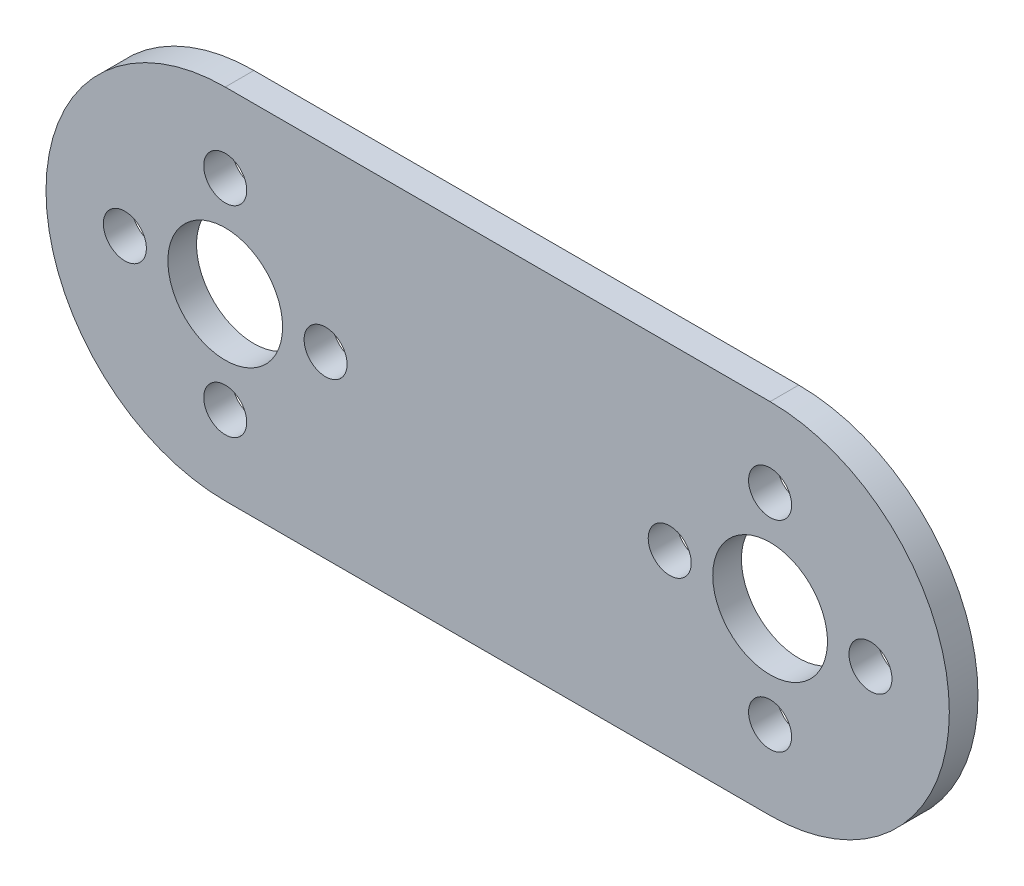
ISO-10303-21;
HEADER;
FILE_DESCRIPTION(('STEP AP214'),'2;1');
FILE_NAME('part.step','',(''),(''),'','','');
FILE_SCHEMA(('AUTOMOTIVE_DESIGN { 1 0 10303 214 1 1 1 1 }'));
ENDSEC;
DATA;
#1=APPLICATION_CONTEXT('core data for automotive mechanical design processes');
#2=APPLICATION_PROTOCOL_DEFINITION('international standard','automotive_design',2000,#1);
#3=PRODUCT_CONTEXT('',#1,'mechanical');
#4=PRODUCT('Part','Part','',(#3));
#5=PRODUCT_RELATED_PRODUCT_CATEGORY('part','',(#4));
#6=PRODUCT_DEFINITION_FORMATION('','',#4);
#7=PRODUCT_DEFINITION_CONTEXT('part definition',#1,'design');
#8=PRODUCT_DEFINITION('design','',#6,#7);
#9=PRODUCT_DEFINITION_SHAPE('','',#8);
#10=(LENGTH_UNIT() NAMED_UNIT(*) SI_UNIT(.MILLI.,.METRE.));
#11=(NAMED_UNIT(*) PLANE_ANGLE_UNIT() SI_UNIT($,.RADIAN.));
#12=(NAMED_UNIT(*) SI_UNIT($,.STERADIAN.) SOLID_ANGLE_UNIT());
#13=UNCERTAINTY_MEASURE_WITH_UNIT(LENGTH_MEASURE(1.E-05),#10,'distance_accuracy_value','');
#14=(GEOMETRIC_REPRESENTATION_CONTEXT(3) GLOBAL_UNCERTAINTY_ASSIGNED_CONTEXT((#13)) GLOBAL_UNIT_ASSIGNED_CONTEXT((#10,
#11,#12)) REPRESENTATION_CONTEXT('',''));
#15=CARTESIAN_POINT('',(0.,0.,0.));
#16=DIRECTION('',(0.,0.,1.));
#17=DIRECTION('',(1.,0.,0.));
#18=AXIS2_PLACEMENT_3D('',#15,#16,#17);
#19=CARTESIAN_POINT('',(0.,0.,2.));
#20=DIRECTION('',(0.,0.,1.));
#21=DIRECTION('',(1.,0.,0.));
#22=AXIS2_PLACEMENT_3D('',#19,#20,#21);
#23=PLANE('',#22);
#24=CARTESIAN_POINT('',(38.,7.,2.));
#25=DIRECTION('',(0.,0.,1.));
#26=DIRECTION('',(-1.,0.,0.));
#27=AXIS2_PLACEMENT_3D('',#24,#25,#26);
#28=CIRCLE('',#27,1.5);
#29=CARTESIAN_POINT('',(36.5,7.,2.));
#30=VERTEX_POINT('',#29);
#31=EDGE_CURVE('E188',#30,#30,#28,.T.);
#32=ORIENTED_EDGE('',*,*,#31,.F.);
#33=EDGE_LOOP('',(#32));
#34=FACE_BOUND('',#33,.T.);
#35=CARTESIAN_POINT('',(38.,-7.,2.));
#36=DIRECTION('',(0.,0.,1.));
#37=DIRECTION('',(-1.,0.,0.));
#38=AXIS2_PLACEMENT_3D('',#35,#36,#37);
#39=CIRCLE('',#38,1.5);
#40=CARTESIAN_POINT('',(36.5,-7.,2.));
#41=VERTEX_POINT('',#40);
#42=EDGE_CURVE('E173',#41,#41,#39,.T.);
#43=ORIENTED_EDGE('',*,*,#42,.F.);
#44=EDGE_LOOP('',(#43));
#45=FACE_BOUND('',#44,.T.);
#46=CARTESIAN_POINT('',(-7.,0.,2.));
#47=DIRECTION('',(0.,0.,1.));
#48=DIRECTION('',(1.,0.,0.));
#49=AXIS2_PLACEMENT_3D('',#46,#47,#48);
#50=CIRCLE('',#49,1.5);
#51=CARTESIAN_POINT('',(-5.5,0.,2.));
#52=VERTEX_POINT('',#51);
#53=EDGE_CURVE('E157',#52,#52,#50,.T.);
#54=ORIENTED_EDGE('',*,*,#53,.F.);
#55=EDGE_LOOP('',(#54));
#56=FACE_BOUND('',#55,.T.);
#57=CARTESIAN_POINT('',(7.,0.,2.));
#58=DIRECTION('',(0.,0.,1.));
#59=DIRECTION('',(1.,0.,0.));
#60=AXIS2_PLACEMENT_3D('',#57,#58,#59);
#61=CIRCLE('',#60,1.5);
#62=CARTESIAN_POINT('',(8.5,0.,2.));
#63=VERTEX_POINT('',#62);
#64=EDGE_CURVE('E141',#63,#63,#61,.T.);
#65=ORIENTED_EDGE('',*,*,#64,.F.);
#66=EDGE_LOOP('',(#65));
#67=FACE_BOUND('',#66,.T.);
#68=CARTESIAN_POINT('',(0.,0.,2.));
#69=DIRECTION('',(0.,0.,1.));
#70=DIRECTION('',(1.,0.,0.));
#71=AXIS2_PLACEMENT_3D('',#68,#69,#70);
#72=CIRCLE('',#71,4.);
#73=CARTESIAN_POINT('',(4.,0.,2.));
#74=VERTEX_POINT('',#73);
#75=EDGE_CURVE('E112',#74,#74,#72,.T.);
#76=ORIENTED_EDGE('',*,*,#75,.F.);
#77=EDGE_LOOP('',(#76));
#78=FACE_BOUND('',#77,.T.);
#79=CARTESIAN_POINT('',(0.,0.,2.));
#80=DIRECTION('',(0.,0.,1.));
#81=DIRECTION('',(1.,0.,0.));
#82=AXIS2_PLACEMENT_3D('',#79,#80,#81);
#83=CIRCLE('',#82,12.5);
#84=CARTESIAN_POINT('',(0.,12.5,2.));
#85=VERTEX_POINT('',#84);
#86=CARTESIAN_POINT('',(0.,-12.5,2.));
#87=VERTEX_POINT('',#86);
#88=EDGE_CURVE('E90',#85,#87,#83,.T.);
#89=ORIENTED_EDGE('',*,*,#88,.T.);
#90=DIRECTION('',(1.,0.,0.));
#91=VECTOR('',#90,1.);
#92=CARTESIAN_POINT('',(0.,-12.5,2.));
#93=LINE('',#92,#91);
#94=CARTESIAN_POINT('',(38.,-12.5,2.));
#95=VERTEX_POINT('',#94);
#96=EDGE_CURVE('E85',#87,#95,#93,.T.);
#97=ORIENTED_EDGE('',*,*,#96,.T.);
#98=CARTESIAN_POINT('',(38.,0.,2.));
#99=DIRECTION('',(0.,0.,1.));
#100=DIRECTION('',(1.,0.,0.));
#101=AXIS2_PLACEMENT_3D('',#98,#99,#100);
#102=CIRCLE('',#101,12.5);
#103=CARTESIAN_POINT('',(38.,12.5,2.));
#104=VERTEX_POINT('',#103);
#105=EDGE_CURVE('E88',#95,#104,#102,.T.);
#106=ORIENTED_EDGE('',*,*,#105,.T.);
#107=DIRECTION('',(-1.,0.,0.));
#108=VECTOR('',#107,1.);
#109=CARTESIAN_POINT('',(0.,12.5,2.));
#110=LINE('',#109,#108);
#111=EDGE_CURVE('E55',#104,#85,#110,.T.);
#112=ORIENTED_EDGE('',*,*,#111,.T.);
#113=EDGE_LOOP('',(#89,#97,#106,#112));
#114=FACE_BOUND('',#113,.T.);
#115=CARTESIAN_POINT('',(0.,7.,2.));
#116=DIRECTION('',(0.,0.,1.));
#117=DIRECTION('',(1.,0.,0.));
#118=AXIS2_PLACEMENT_3D('',#115,#116,#117);
#119=CIRCLE('',#118,1.5);
#120=CARTESIAN_POINT('',(1.5,7.,2.));
#121=VERTEX_POINT('',#120);
#122=EDGE_CURVE('E134',#121,#121,#119,.T.);
#123=ORIENTED_EDGE('',*,*,#122,.F.);
#124=EDGE_LOOP('',(#123));
#125=FACE_BOUND('',#124,.T.);
#126=CARTESIAN_POINT('',(0.,-7.,2.));
#127=DIRECTION('',(0.,0.,1.));
#128=DIRECTION('',(1.,0.,0.));
#129=AXIS2_PLACEMENT_3D('',#126,#127,#128);
#130=CIRCLE('',#129,1.5);
#131=CARTESIAN_POINT('',(1.5,-7.,2.));
#132=VERTEX_POINT('',#131);
#133=EDGE_CURVE('E149',#132,#132,#130,.T.);
#134=ORIENTED_EDGE('',*,*,#133,.F.);
#135=EDGE_LOOP('',(#134));
#136=FACE_BOUND('',#135,.T.);
#137=CARTESIAN_POINT('',(45.,0.,2.));
#138=DIRECTION('',(0.,0.,1.));
#139=DIRECTION('',(-1.,0.,0.));
#140=AXIS2_PLACEMENT_3D('',#137,#138,#139);
#141=CIRCLE('',#140,1.5);
#142=CARTESIAN_POINT('',(43.5,0.,2.));
#143=VERTEX_POINT('',#142);
#144=EDGE_CURVE('E165',#143,#143,#141,.T.);
#145=ORIENTED_EDGE('',*,*,#144,.F.);
#146=EDGE_LOOP('',(#145));
#147=FACE_BOUND('',#146,.T.);
#148=CARTESIAN_POINT('',(31.,0.,2.));
#149=DIRECTION('',(0.,0.,1.));
#150=DIRECTION('',(-1.,0.,0.));
#151=AXIS2_PLACEMENT_3D('',#148,#149,#150);
#152=CIRCLE('',#151,1.5);
#153=CARTESIAN_POINT('',(29.5,0.,2.));
#154=VERTEX_POINT('',#153);
#155=EDGE_CURVE('E180',#154,#154,#152,.T.);
#156=ORIENTED_EDGE('',*,*,#155,.F.);
#157=EDGE_LOOP('',(#156));
#158=FACE_BOUND('',#157,.T.);
#159=CARTESIAN_POINT('',(38.,0.,2.));
#160=DIRECTION('',(0.,0.,1.));
#161=DIRECTION('',(-1.,0.,0.));
#162=AXIS2_PLACEMENT_3D('',#159,#160,#161);
#163=CIRCLE('',#162,4.);
#164=CARTESIAN_POINT('',(34.,0.,2.));
#165=VERTEX_POINT('',#164);
#166=EDGE_CURVE('E196',#165,#165,#163,.T.);
#167=ORIENTED_EDGE('',*,*,#166,.F.);
#168=EDGE_LOOP('',(#167));
#169=FACE_BOUND('',#168,.T.);
#170=ADVANCED_FACE('F37',(#34,#45,#56,#67,#78,#114,#125,#136,#147,#158,#169),#23,.T.);
#171=CARTESIAN_POINT('',(0.,0.,0.));
#172=DIRECTION('',(0.,0.,1.));
#173=DIRECTION('',(1.,0.,0.));
#174=AXIS2_PLACEMENT_3D('',#171,#172,#173);
#175=PLANE('',#174);
#176=CARTESIAN_POINT('',(38.,7.,0.));
#177=DIRECTION('',(0.,0.,1.));
#178=DIRECTION('',(-1.,0.,0.));
#179=AXIS2_PLACEMENT_3D('',#176,#177,#178);
#180=CIRCLE('',#179,1.5);
#181=CARTESIAN_POINT('',(36.5,7.,0.));
#182=VERTEX_POINT('',#181);
#183=EDGE_CURVE('E192',#182,#182,#180,.T.);
#184=ORIENTED_EDGE('',*,*,#183,.T.);
#185=EDGE_LOOP('',(#184));
#186=FACE_BOUND('',#185,.T.);
#187=CARTESIAN_POINT('',(38.,-7.,0.));
#188=DIRECTION('',(0.,0.,1.));
#189=DIRECTION('',(-1.,0.,0.));
#190=AXIS2_PLACEMENT_3D('',#187,#188,#189);
#191=CIRCLE('',#190,1.5);
#192=CARTESIAN_POINT('',(36.5,-7.,0.));
#193=VERTEX_POINT('',#192);
#194=EDGE_CURVE('E177',#193,#193,#191,.T.);
#195=ORIENTED_EDGE('',*,*,#194,.T.);
#196=EDGE_LOOP('',(#195));
#197=FACE_BOUND('',#196,.T.);
#198=CARTESIAN_POINT('',(-7.,0.,0.));
#199=DIRECTION('',(0.,0.,1.));
#200=DIRECTION('',(1.,0.,0.));
#201=AXIS2_PLACEMENT_3D('',#198,#199,#200);
#202=CIRCLE('',#201,1.5);
#203=CARTESIAN_POINT('',(-5.5,0.,0.));
#204=VERTEX_POINT('',#203);
#205=EDGE_CURVE('E161',#204,#204,#202,.T.);
#206=ORIENTED_EDGE('',*,*,#205,.T.);
#207=EDGE_LOOP('',(#206));
#208=FACE_BOUND('',#207,.T.);
#209=CARTESIAN_POINT('',(7.,0.,0.));
#210=DIRECTION('',(0.,0.,1.));
#211=DIRECTION('',(1.,0.,0.));
#212=AXIS2_PLACEMENT_3D('',#209,#210,#211);
#213=CIRCLE('',#212,1.5);
#214=CARTESIAN_POINT('',(8.5,0.,0.));
#215=VERTEX_POINT('',#214);
#216=EDGE_CURVE('E145',#215,#215,#213,.T.);
#217=ORIENTED_EDGE('',*,*,#216,.T.);
#218=EDGE_LOOP('',(#217));
#219=FACE_BOUND('',#218,.T.);
#220=CARTESIAN_POINT('',(0.,0.,0.));
#221=DIRECTION('',(0.,0.,1.));
#222=DIRECTION('',(1.,0.,0.));
#223=AXIS2_PLACEMENT_3D('',#220,#221,#222);
#224=CIRCLE('',#223,4.);
#225=CARTESIAN_POINT('',(4.,0.,0.));
#226=VERTEX_POINT('',#225);
#227=EDGE_CURVE('E130',#226,#226,#224,.T.);
#228=ORIENTED_EDGE('',*,*,#227,.T.);
#229=EDGE_LOOP('',(#228));
#230=FACE_BOUND('',#229,.T.);
#231=CARTESIAN_POINT('',(0.,0.,0.));
#232=DIRECTION('',(0.,0.,1.));
#233=DIRECTION('',(1.,0.,0.));
#234=AXIS2_PLACEMENT_3D('',#231,#232,#233);
#235=CIRCLE('',#234,12.5);
#236=CARTESIAN_POINT('',(0.,12.5,0.));
#237=VERTEX_POINT('',#236);
#238=CARTESIAN_POINT('',(0.,-12.5,0.));
#239=VERTEX_POINT('',#238);
#240=EDGE_CURVE('E108',#237,#239,#235,.T.);
#241=ORIENTED_EDGE('',*,*,#240,.F.);
#242=DIRECTION('',(-1.,0.,0.));
#243=VECTOR('',#242,1.);
#244=CARTESIAN_POINT('',(0.,12.5,0.));
#245=LINE('',#244,#243);
#246=CARTESIAN_POINT('',(38.,12.5,0.));
#247=VERTEX_POINT('',#246);
#248=EDGE_CURVE('E78',#247,#237,#245,.T.);
#249=ORIENTED_EDGE('',*,*,#248,.F.);
#250=CARTESIAN_POINT('',(38.,0.,0.));
#251=DIRECTION('',(0.,0.,1.));
#252=DIRECTION('',(1.,0.,0.));
#253=AXIS2_PLACEMENT_3D('',#250,#251,#252);
#254=CIRCLE('',#253,12.5);
#255=CARTESIAN_POINT('',(38.,-12.5,0.));
#256=VERTEX_POINT('',#255);
#257=EDGE_CURVE('E72',#256,#247,#254,.T.);
#258=ORIENTED_EDGE('',*,*,#257,.F.);
#259=DIRECTION('',(1.,0.,0.));
#260=VECTOR('',#259,1.);
#261=CARTESIAN_POINT('',(0.,-12.5,0.));
#262=LINE('',#261,#260);
#263=EDGE_CURVE('E95',#239,#256,#262,.T.);
#264=ORIENTED_EDGE('',*,*,#263,.F.);
#265=EDGE_LOOP('',(#241,#249,#258,#264));
#266=FACE_BOUND('',#265,.T.);
#267=CARTESIAN_POINT('',(0.,7.,0.));
#268=DIRECTION('',(0.,0.,1.));
#269=DIRECTION('',(1.,0.,0.));
#270=AXIS2_PLACEMENT_3D('',#267,#268,#269);
#271=CIRCLE('',#270,1.5);
#272=CARTESIAN_POINT('',(1.5,7.,0.));
#273=VERTEX_POINT('',#272);
#274=EDGE_CURVE('E138',#273,#273,#271,.T.);
#275=ORIENTED_EDGE('',*,*,#274,.T.);
#276=EDGE_LOOP('',(#275));
#277=FACE_BOUND('',#276,.T.);
#278=CARTESIAN_POINT('',(0.,-7.,0.));
#279=DIRECTION('',(0.,0.,1.));
#280=DIRECTION('',(1.,0.,0.));
#281=AXIS2_PLACEMENT_3D('',#278,#279,#280);
#282=CIRCLE('',#281,1.5);
#283=CARTESIAN_POINT('',(1.5,-7.,0.));
#284=VERTEX_POINT('',#283);
#285=EDGE_CURVE('E153',#284,#284,#282,.T.);
#286=ORIENTED_EDGE('',*,*,#285,.T.);
#287=EDGE_LOOP('',(#286));
#288=FACE_BOUND('',#287,.T.);
#289=CARTESIAN_POINT('',(45.,0.,0.));
#290=DIRECTION('',(0.,0.,1.));
#291=DIRECTION('',(-1.,0.,0.));
#292=AXIS2_PLACEMENT_3D('',#289,#290,#291);
#293=CIRCLE('',#292,1.5);
#294=CARTESIAN_POINT('',(43.5,0.,0.));
#295=VERTEX_POINT('',#294);
#296=EDGE_CURVE('E169',#295,#295,#293,.T.);
#297=ORIENTED_EDGE('',*,*,#296,.T.);
#298=EDGE_LOOP('',(#297));
#299=FACE_BOUND('',#298,.T.);
#300=CARTESIAN_POINT('',(31.,0.,0.));
#301=DIRECTION('',(0.,0.,1.));
#302=DIRECTION('',(-1.,0.,0.));
#303=AXIS2_PLACEMENT_3D('',#300,#301,#302);
#304=CIRCLE('',#303,1.5);
#305=CARTESIAN_POINT('',(29.5,0.,0.));
#306=VERTEX_POINT('',#305);
#307=EDGE_CURVE('E184',#306,#306,#304,.T.);
#308=ORIENTED_EDGE('',*,*,#307,.T.);
#309=EDGE_LOOP('',(#308));
#310=FACE_BOUND('',#309,.T.);
#311=CARTESIAN_POINT('',(38.,0.,0.));
#312=DIRECTION('',(0.,0.,1.));
#313=DIRECTION('',(-1.,0.,0.));
#314=AXIS2_PLACEMENT_3D('',#311,#312,#313);
#315=CIRCLE('',#314,4.);
#316=CARTESIAN_POINT('',(34.,0.,0.));
#317=VERTEX_POINT('',#316);
#318=EDGE_CURVE('E200',#317,#317,#315,.T.);
#319=ORIENTED_EDGE('',*,*,#318,.T.);
#320=EDGE_LOOP('',(#319));
#321=FACE_BOUND('',#320,.T.);
#322=ADVANCED_FACE('F124',(#186,#197,#208,#219,#230,#266,#277,#288,#299,#310,#321),#175,.F.);
#323=CARTESIAN_POINT('',(0.,0.,2.));
#324=DIRECTION('',(0.,0.,-1.));
#325=DIRECTION('',(-1.,0.,0.));
#326=AXIS2_PLACEMENT_3D('',#323,#324,#325);
#327=CYLINDRICAL_SURFACE('',#326,12.5);
#328=ORIENTED_EDGE('',*,*,#240,.T.);
#329=DIRECTION('',(0.,0.,-1.));
#330=VECTOR('',#329,1.);
#331=CARTESIAN_POINT('',(0.,-12.5,2.));
#332=LINE('',#331,#330);
#333=EDGE_CURVE('E11',#87,#239,#332,.T.);
#334=ORIENTED_EDGE('',*,*,#333,.F.);
#335=ORIENTED_EDGE('',*,*,#88,.F.);
#336=DIRECTION('',(0.,0.,-1.));
#337=VECTOR('',#336,1.);
#338=CARTESIAN_POINT('',(0.,12.5,2.));
#339=LINE('',#338,#337);
#340=EDGE_CURVE('E104',#85,#237,#339,.T.);
#341=ORIENTED_EDGE('',*,*,#340,.T.);
#342=EDGE_LOOP('',(#328,#334,#335,#341));
#343=FACE_BOUND('',#342,.T.);
#344=ADVANCED_FACE('F39',(#343),#327,.T.);
#345=CARTESIAN_POINT('',(0.,-12.5,2.));
#346=DIRECTION('',(0.,1.,0.));
#347=DIRECTION('',(-1.,0.,0.));
#348=AXIS2_PLACEMENT_3D('',#345,#346,#347);
#349=PLANE('',#348);
#350=ORIENTED_EDGE('',*,*,#263,.T.);
#351=DIRECTION('',(0.,0.,-1.));
#352=VECTOR('',#351,1.);
#353=CARTESIAN_POINT('',(38.,-12.5,2.));
#354=LINE('',#353,#352);
#355=EDGE_CURVE('E47',#95,#256,#354,.T.);
#356=ORIENTED_EDGE('',*,*,#355,.F.);
#357=ORIENTED_EDGE('',*,*,#96,.F.);
#358=ORIENTED_EDGE('',*,*,#333,.T.);
#359=EDGE_LOOP('',(#350,#356,#357,#358));
#360=FACE_BOUND('',#359,.T.);
#361=ADVANCED_FACE('F94',(#360),#349,.F.);
#362=CARTESIAN_POINT('',(38.,0.,2.));
#363=DIRECTION('',(0.,0.,-1.));
#364=DIRECTION('',(-1.,0.,0.));
#365=AXIS2_PLACEMENT_3D('',#362,#363,#364);
#366=CYLINDRICAL_SURFACE('',#365,12.5);
#367=ORIENTED_EDGE('',*,*,#257,.T.);
#368=DIRECTION('',(0.,0.,-1.));
#369=VECTOR('',#368,1.);
#370=CARTESIAN_POINT('',(38.,12.5,2.));
#371=LINE('',#370,#369);
#372=EDGE_CURVE('E97',#104,#247,#371,.T.);
#373=ORIENTED_EDGE('',*,*,#372,.F.);
#374=ORIENTED_EDGE('',*,*,#105,.F.);
#375=ORIENTED_EDGE('',*,*,#355,.T.);
#376=EDGE_LOOP('',(#367,#373,#374,#375));
#377=FACE_BOUND('',#376,.T.);
#378=ADVANCED_FACE('F98',(#377),#366,.T.);
#379=CARTESIAN_POINT('',(0.,12.5,2.));
#380=DIRECTION('',(0.,-1.,0.));
#381=DIRECTION('',(1.,0.,0.));
#382=AXIS2_PLACEMENT_3D('',#379,#380,#381);
#383=PLANE('',#382);
#384=ORIENTED_EDGE('',*,*,#248,.T.);
#385=ORIENTED_EDGE('',*,*,#340,.F.);
#386=ORIENTED_EDGE('',*,*,#111,.F.);
#387=ORIENTED_EDGE('',*,*,#372,.T.);
#388=EDGE_LOOP('',(#384,#385,#386,#387));
#389=FACE_BOUND('',#388,.T.);
#390=ADVANCED_FACE('F121',(#389),#383,.F.);
#391=CARTESIAN_POINT('',(0.,0.,2.));
#392=DIRECTION('',(0.,0.,-1.));
#393=DIRECTION('',(-1.,0.,0.));
#394=AXIS2_PLACEMENT_3D('',#391,#392,#393);
#395=CYLINDRICAL_SURFACE('',#394,4.);
#396=ORIENTED_EDGE('',*,*,#75,.T.);
#397=EDGE_LOOP('',(#396));
#398=FACE_BOUND('',#397,.T.);
#399=ORIENTED_EDGE('',*,*,#227,.F.);
#400=EDGE_LOOP('',(#399));
#401=FACE_BOUND('',#400,.T.);
#402=ADVANCED_FACE('F222',(#398,#401),#395,.F.);
#403=CARTESIAN_POINT('',(0.,7.,2.));
#404=DIRECTION('',(0.,0.,-1.));
#405=DIRECTION('',(-1.,0.,0.));
#406=AXIS2_PLACEMENT_3D('',#403,#404,#405);
#407=CYLINDRICAL_SURFACE('',#406,1.5);
#408=ORIENTED_EDGE('',*,*,#122,.T.);
#409=EDGE_LOOP('',(#408));
#410=FACE_BOUND('',#409,.T.);
#411=ORIENTED_EDGE('',*,*,#274,.F.);
#412=EDGE_LOOP('',(#411));
#413=FACE_BOUND('',#412,.T.);
#414=ADVANCED_FACE('F274',(#410,#413),#407,.F.);
#415=CARTESIAN_POINT('',(7.,0.,2.));
#416=DIRECTION('',(0.,0.,-1.));
#417=DIRECTION('',(-1.,0.,0.));
#418=AXIS2_PLACEMENT_3D('',#415,#416,#417);
#419=CYLINDRICAL_SURFACE('',#418,1.5);
#420=ORIENTED_EDGE('',*,*,#64,.T.);
#421=EDGE_LOOP('',(#420));
#422=FACE_BOUND('',#421,.T.);
#423=ORIENTED_EDGE('',*,*,#216,.F.);
#424=EDGE_LOOP('',(#423));
#425=FACE_BOUND('',#424,.T.);
#426=ADVANCED_FACE('F283',(#422,#425),#419,.F.);
#427=CARTESIAN_POINT('',(0.,-7.,2.));
#428=DIRECTION('',(0.,0.,-1.));
#429=DIRECTION('',(-1.,0.,0.));
#430=AXIS2_PLACEMENT_3D('',#427,#428,#429);
#431=CYLINDRICAL_SURFACE('',#430,1.5);
#432=ORIENTED_EDGE('',*,*,#133,.T.);
#433=EDGE_LOOP('',(#432));
#434=FACE_BOUND('',#433,.T.);
#435=ORIENTED_EDGE('',*,*,#285,.F.);
#436=EDGE_LOOP('',(#435));
#437=FACE_BOUND('',#436,.T.);
#438=ADVANCED_FACE('F292',(#434,#437),#431,.F.);
#439=CARTESIAN_POINT('',(-7.,0.,2.));
#440=DIRECTION('',(0.,0.,-1.));
#441=DIRECTION('',(-1.,0.,0.));
#442=AXIS2_PLACEMENT_3D('',#439,#440,#441);
#443=CYLINDRICAL_SURFACE('',#442,1.5);
#444=ORIENTED_EDGE('',*,*,#53,.T.);
#445=EDGE_LOOP('',(#444));
#446=FACE_BOUND('',#445,.T.);
#447=ORIENTED_EDGE('',*,*,#205,.F.);
#448=EDGE_LOOP('',(#447));
#449=FACE_BOUND('',#448,.T.);
#450=ADVANCED_FACE('F302',(#446,#449),#443,.F.);
#451=CARTESIAN_POINT('',(45.,0.,2.));
#452=DIRECTION('',(0.,0.,-1.));
#453=DIRECTION('',(-1.,0.,0.));
#454=AXIS2_PLACEMENT_3D('',#451,#452,#453);
#455=CYLINDRICAL_SURFACE('',#454,1.5);
#456=ORIENTED_EDGE('',*,*,#144,.T.);
#457=EDGE_LOOP('',(#456));
#458=FACE_BOUND('',#457,.T.);
#459=ORIENTED_EDGE('',*,*,#296,.F.);
#460=EDGE_LOOP('',(#459));
#461=FACE_BOUND('',#460,.T.);
#462=ADVANCED_FACE('F312',(#458,#461),#455,.F.);
#463=CARTESIAN_POINT('',(38.,-7.,2.));
#464=DIRECTION('',(0.,0.,-1.));
#465=DIRECTION('',(-1.,0.,0.));
#466=AXIS2_PLACEMENT_3D('',#463,#464,#465);
#467=CYLINDRICAL_SURFACE('',#466,1.5);
#468=ORIENTED_EDGE('',*,*,#42,.T.);
#469=EDGE_LOOP('',(#468));
#470=FACE_BOUND('',#469,.T.);
#471=ORIENTED_EDGE('',*,*,#194,.F.);
#472=EDGE_LOOP('',(#471));
#473=FACE_BOUND('',#472,.T.);
#474=ADVANCED_FACE('F322',(#470,#473),#467,.F.);
#475=CARTESIAN_POINT('',(31.,0.,2.));
#476=DIRECTION('',(0.,0.,-1.));
#477=DIRECTION('',(-1.,0.,0.));
#478=AXIS2_PLACEMENT_3D('',#475,#476,#477);
#479=CYLINDRICAL_SURFACE('',#478,1.5);
#480=ORIENTED_EDGE('',*,*,#155,.T.);
#481=EDGE_LOOP('',(#480));
#482=FACE_BOUND('',#481,.T.);
#483=ORIENTED_EDGE('',*,*,#307,.F.);
#484=EDGE_LOOP('',(#483));
#485=FACE_BOUND('',#484,.T.);
#486=ADVANCED_FACE('F332',(#482,#485),#479,.F.);
#487=CARTESIAN_POINT('',(38.,7.,2.));
#488=DIRECTION('',(0.,0.,-1.));
#489=DIRECTION('',(-1.,0.,0.));
#490=AXIS2_PLACEMENT_3D('',#487,#488,#489);
#491=CYLINDRICAL_SURFACE('',#490,1.5);
#492=ORIENTED_EDGE('',*,*,#31,.T.);
#493=EDGE_LOOP('',(#492));
#494=FACE_BOUND('',#493,.T.);
#495=ORIENTED_EDGE('',*,*,#183,.F.);
#496=EDGE_LOOP('',(#495));
#497=FACE_BOUND('',#496,.T.);
#498=ADVANCED_FACE('F342',(#494,#497),#491,.F.);
#499=CARTESIAN_POINT('',(38.,0.,2.));
#500=DIRECTION('',(0.,0.,-1.));
#501=DIRECTION('',(-1.,0.,0.));
#502=AXIS2_PLACEMENT_3D('',#499,#500,#501);
#503=CYLINDRICAL_SURFACE('',#502,4.);
#504=ORIENTED_EDGE('',*,*,#166,.T.);
#505=EDGE_LOOP('',(#504));
#506=FACE_BOUND('',#505,.T.);
#507=ORIENTED_EDGE('',*,*,#318,.F.);
#508=EDGE_LOOP('',(#507));
#509=FACE_BOUND('',#508,.T.);
#510=ADVANCED_FACE('F208',(#506,#509),#503,.F.);
#511=CLOSED_SHELL('',(#170,#322,#344,#361,#378,#390,#402,#414,#426,#438,#450,#462,#474,#486,
#498,#510));
#512=MANIFOLD_SOLID_BREP('B2',#511);
#513=ADVANCED_BREP_SHAPE_REPRESENTATION('',(#18,#512),#14);
#514=SHAPE_DEFINITION_REPRESENTATION(#9,#513);
ENDSEC;
END-ISO-10303-21;
